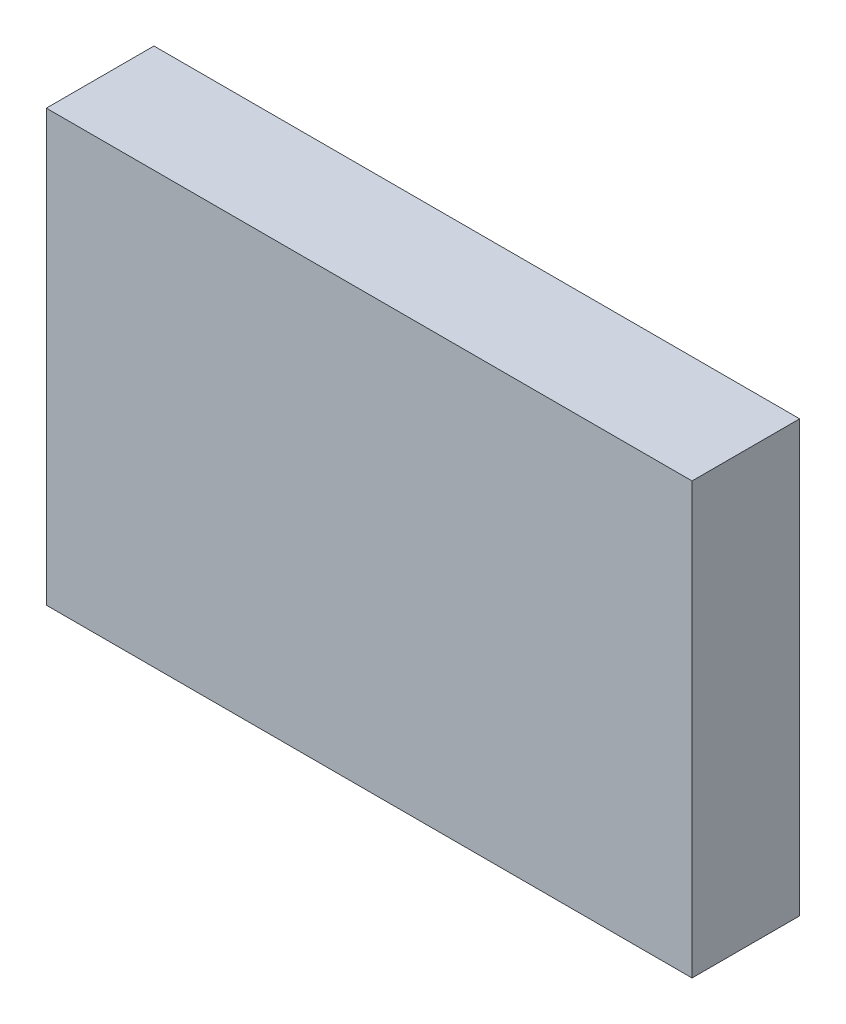
ISO-10303-21;
HEADER;
FILE_DESCRIPTION(('STEP AP214'),'2;1');
FILE_NAME('part.step','',(''),(''),'','','');
FILE_SCHEMA(('AUTOMOTIVE_DESIGN { 1 0 10303 214 1 1 1 1 }'));
ENDSEC;
DATA;
#1=APPLICATION_CONTEXT('core data for automotive mechanical design processes');
#2=APPLICATION_PROTOCOL_DEFINITION('international standard','automotive_design',2000,#1);
#3=PRODUCT_CONTEXT('',#1,'mechanical');
#4=PRODUCT('Part','Part','',(#3));
#5=PRODUCT_RELATED_PRODUCT_CATEGORY('part','',(#4));
#6=PRODUCT_DEFINITION_FORMATION('','',#4);
#7=PRODUCT_DEFINITION_CONTEXT('part definition',#1,'design');
#8=PRODUCT_DEFINITION('design','',#6,#7);
#9=PRODUCT_DEFINITION_SHAPE('','',#8);
#10=(LENGTH_UNIT() NAMED_UNIT(*) SI_UNIT(.MILLI.,.METRE.));
#11=(NAMED_UNIT(*) PLANE_ANGLE_UNIT() SI_UNIT($,.RADIAN.));
#12=(NAMED_UNIT(*) SI_UNIT($,.STERADIAN.) SOLID_ANGLE_UNIT());
#13=UNCERTAINTY_MEASURE_WITH_UNIT(LENGTH_MEASURE(1.E-05),#10,'distance_accuracy_value','');
#14=(GEOMETRIC_REPRESENTATION_CONTEXT(3) GLOBAL_UNCERTAINTY_ASSIGNED_CONTEXT((#13)) GLOBAL_UNIT_ASSIGNED_CONTEXT((#10,
#11,#12)) REPRESENTATION_CONTEXT('',''));
#15=CARTESIAN_POINT('',(0.,0.,0.));
#16=DIRECTION('',(0.,0.,1.));
#17=DIRECTION('',(1.,0.,0.));
#18=AXIS2_PLACEMENT_3D('',#15,#16,#17);
#19=CARTESIAN_POINT('',(-15.,-10.,55.));
#20=DIRECTION('',(1.,0.,0.));
#21=DIRECTION('',(0.,0.,-1.));
#22=AXIS2_PLACEMENT_3D('',#19,#20,#21);
#23=PLANE('',#22);
#24=DIRECTION('',(0.,-1.,0.));
#25=VECTOR('',#24,1.);
#26=CARTESIAN_POINT('',(-15.,-10.,50.));
#27=LINE('',#26,#25);
#28=CARTESIAN_POINT('',(-15.,9.99999999999999,50.));
#29=VERTEX_POINT('',#28);
#30=CARTESIAN_POINT('',(-15.,-10.,50.));
#31=VERTEX_POINT('',#30);
#32=EDGE_CURVE('E107',#29,#31,#27,.T.);
#33=ORIENTED_EDGE('',*,*,#32,.T.);
#34=DIRECTION('',(0.,0.,-1.));
#35=VECTOR('',#34,1.);
#36=CARTESIAN_POINT('',(-15.,-10.,55.));
#37=LINE('',#36,#35);
#38=CARTESIAN_POINT('',(-15.,-10.,55.));
#39=VERTEX_POINT('',#38);
#40=EDGE_CURVE('E11',#39,#31,#37,.T.);
#41=ORIENTED_EDGE('',*,*,#40,.F.);
#42=DIRECTION('',(0.,-1.,0.));
#43=VECTOR('',#42,1.);
#44=CARTESIAN_POINT('',(-15.,-10.,55.));
#45=LINE('',#44,#43);
#46=CARTESIAN_POINT('',(-15.,9.99999999999999,55.));
#47=VERTEX_POINT('',#46);
#48=EDGE_CURVE('E91',#47,#39,#45,.T.);
#49=ORIENTED_EDGE('',*,*,#48,.F.);
#50=DIRECTION('',(0.,0.,-1.));
#51=VECTOR('',#50,1.);
#52=CARTESIAN_POINT('',(-15.,9.99999999999999,55.));
#53=LINE('',#52,#51);
#54=EDGE_CURVE('E103',#47,#29,#53,.T.);
#55=ORIENTED_EDGE('',*,*,#54,.T.);
#56=EDGE_LOOP('',(#33,#41,#49,#55));
#57=FACE_BOUND('',#56,.T.);
#58=ADVANCED_FACE('F39',(#57),#23,.F.);
#59=CARTESIAN_POINT('',(15.,-10.,55.));
#60=DIRECTION('',(0.,1.,0.));
#61=DIRECTION('',(-1.,0.,0.));
#62=AXIS2_PLACEMENT_3D('',#59,#60,#61);
#63=PLANE('',#62);
#64=DIRECTION('',(1.,0.,0.));
#65=VECTOR('',#64,1.);
#66=CARTESIAN_POINT('',(15.,-10.,50.));
#67=LINE('',#66,#65);
#68=CARTESIAN_POINT('',(15.,-10.,50.));
#69=VERTEX_POINT('',#68);
#70=EDGE_CURVE('E96',#31,#69,#67,.T.);
#71=ORIENTED_EDGE('',*,*,#70,.T.);
#72=DIRECTION('',(0.,0.,-1.));
#73=VECTOR('',#72,1.);
#74=CARTESIAN_POINT('',(15.,-10.,55.));
#75=LINE('',#74,#73);
#76=CARTESIAN_POINT('',(15.,-10.,55.));
#77=VERTEX_POINT('',#76);
#78=EDGE_CURVE('E48',#77,#69,#75,.T.);
#79=ORIENTED_EDGE('',*,*,#78,.F.);
#80=DIRECTION('',(1.,0.,0.));
#81=VECTOR('',#80,1.);
#82=CARTESIAN_POINT('',(15.,-10.,55.));
#83=LINE('',#82,#81);
#84=EDGE_CURVE('E86',#39,#77,#83,.T.);
#85=ORIENTED_EDGE('',*,*,#84,.F.);
#86=ORIENTED_EDGE('',*,*,#40,.T.);
#87=EDGE_LOOP('',(#71,#79,#85,#86));
#88=FACE_BOUND('',#87,.T.);
#89=ADVANCED_FACE('F95',(#88),#63,.F.);
#90=CARTESIAN_POINT('',(15.,-10.,55.));
#91=DIRECTION('',(-1.,0.,0.));
#92=DIRECTION('',(0.,0.,1.));
#93=AXIS2_PLACEMENT_3D('',#90,#91,#92);
#94=PLANE('',#93);
#95=DIRECTION('',(0.,1.,0.));
#96=VECTOR('',#95,1.);
#97=CARTESIAN_POINT('',(15.,-10.,50.));
#98=LINE('',#97,#96);
#99=CARTESIAN_POINT('',(15.,10.,50.));
#100=VERTEX_POINT('',#99);
#101=EDGE_CURVE('E73',#69,#100,#98,.T.);
#102=ORIENTED_EDGE('',*,*,#101,.T.);
#103=DIRECTION('',(0.,0.,-1.));
#104=VECTOR('',#103,1.);
#105=CARTESIAN_POINT('',(15.,10.,55.));
#106=LINE('',#105,#104);
#107=CARTESIAN_POINT('',(15.,10.,55.));
#108=VERTEX_POINT('',#107);
#109=EDGE_CURVE('E98',#108,#100,#106,.T.);
#110=ORIENTED_EDGE('',*,*,#109,.F.);
#111=DIRECTION('',(0.,1.,0.));
#112=VECTOR('',#111,1.);
#113=CARTESIAN_POINT('',(15.,-10.,55.));
#114=LINE('',#113,#112);
#115=EDGE_CURVE('E89',#77,#108,#114,.T.);
#116=ORIENTED_EDGE('',*,*,#115,.F.);
#117=ORIENTED_EDGE('',*,*,#78,.T.);
#118=EDGE_LOOP('',(#102,#110,#116,#117));
#119=FACE_BOUND('',#118,.T.);
#120=ADVANCED_FACE('F99',(#119),#94,.F.);
#121=CARTESIAN_POINT('',(15.,10.,55.));
#122=DIRECTION('',(0.,-1.,0.));
#123=DIRECTION('',(1.,0.,0.));
#124=AXIS2_PLACEMENT_3D('',#121,#122,#123);
#125=PLANE('',#124);
#126=DIRECTION('',(-1.,0.,0.));
#127=VECTOR('',#126,1.);
#128=CARTESIAN_POINT('',(15.,10.,50.));
#129=LINE('',#128,#127);
#130=EDGE_CURVE('E79',#100,#29,#129,.T.);
#131=ORIENTED_EDGE('',*,*,#130,.T.);
#132=ORIENTED_EDGE('',*,*,#54,.F.);
#133=DIRECTION('',(-1.,0.,0.));
#134=VECTOR('',#133,1.);
#135=CARTESIAN_POINT('',(15.,10.,55.));
#136=LINE('',#135,#134);
#137=EDGE_CURVE('E56',#108,#47,#136,.T.);
#138=ORIENTED_EDGE('',*,*,#137,.F.);
#139=ORIENTED_EDGE('',*,*,#109,.T.);
#140=EDGE_LOOP('',(#131,#132,#138,#139));
#141=FACE_BOUND('',#140,.T.);
#142=ADVANCED_FACE('F120',(#141),#125,.F.);
#143=CARTESIAN_POINT('',(0.,0.,55.));
#144=DIRECTION('',(0.,0.,1.));
#145=DIRECTION('',(1.,0.,0.));
#146=AXIS2_PLACEMENT_3D('',#143,#144,#145);
#147=PLANE('',#146);
#148=ORIENTED_EDGE('',*,*,#48,.T.);
#149=ORIENTED_EDGE('',*,*,#84,.T.);
#150=ORIENTED_EDGE('',*,*,#115,.T.);
#151=ORIENTED_EDGE('',*,*,#137,.T.);
#152=EDGE_LOOP('',(#148,#149,#150,#151));
#153=FACE_BOUND('',#152,.T.);
#154=ADVANCED_FACE('F87',(#153),#147,.T.);
#155=CARTESIAN_POINT('',(0.,0.,50.));
#156=DIRECTION('',(0.,0.,1.));
#157=DIRECTION('',(1.,0.,0.));
#158=AXIS2_PLACEMENT_3D('',#155,#156,#157);
#159=PLANE('',#158);
#160=ORIENTED_EDGE('',*,*,#32,.F.);
#161=ORIENTED_EDGE('',*,*,#130,.F.);
#162=ORIENTED_EDGE('',*,*,#101,.F.);
#163=ORIENTED_EDGE('',*,*,#70,.F.);
#164=EDGE_LOOP('',(#160,#161,#162,#163));
#165=FACE_BOUND('',#164,.T.);
#166=ADVANCED_FACE('F123',(#165),#159,.F.);
#167=CLOSED_SHELL('',(#58,#89,#120,#142,#154,#166));
#168=MANIFOLD_SOLID_BREP('B2',#167);
#169=ADVANCED_BREP_SHAPE_REPRESENTATION('',(#18,#168),#14);
#170=SHAPE_DEFINITION_REPRESENTATION(#9,#169);
ENDSEC;
END-ISO-10303-21;
